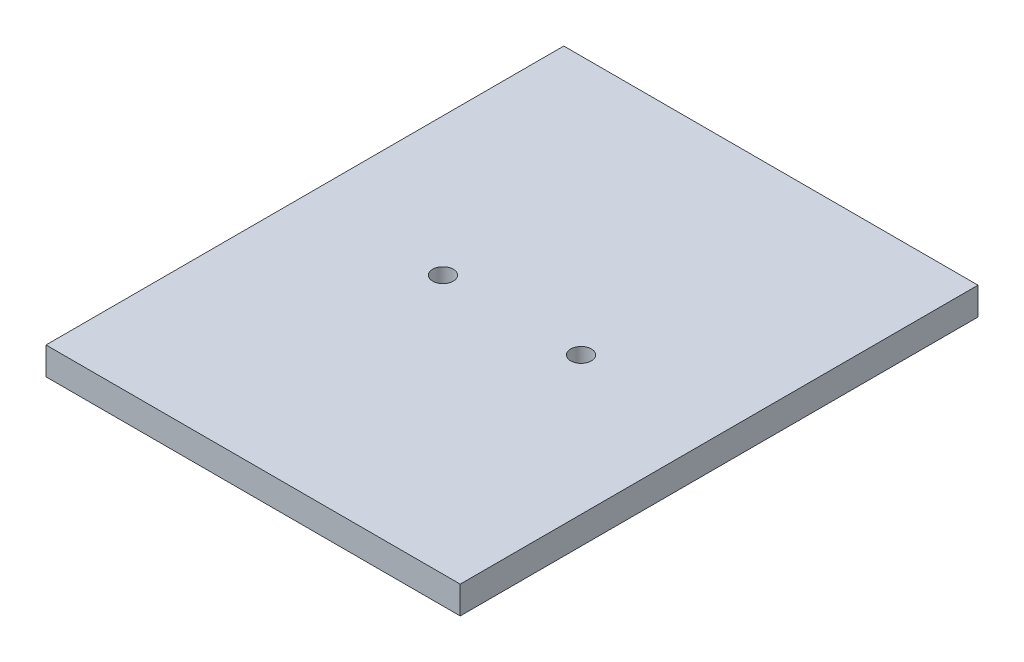
ISO-10303-21;
HEADER;
FILE_DESCRIPTION(('STEP AP214'),'2;1');
FILE_NAME('part.step','',(''),(''),'','','');
FILE_SCHEMA(('AUTOMOTIVE_DESIGN { 1 0 10303 214 1 1 1 1 }'));
ENDSEC;
DATA;
#1=APPLICATION_CONTEXT('core data for automotive mechanical design processes');
#2=APPLICATION_PROTOCOL_DEFINITION('international standard','automotive_design',2000,#1);
#3=PRODUCT_CONTEXT('',#1,'mechanical');
#4=PRODUCT('Part','Part','',(#3));
#5=PRODUCT_RELATED_PRODUCT_CATEGORY('part','',(#4));
#6=PRODUCT_DEFINITION_FORMATION('','',#4);
#7=PRODUCT_DEFINITION_CONTEXT('part definition',#1,'design');
#8=PRODUCT_DEFINITION('design','',#6,#7);
#9=PRODUCT_DEFINITION_SHAPE('','',#8);
#10=(LENGTH_UNIT() NAMED_UNIT(*) SI_UNIT(.MILLI.,.METRE.));
#11=(NAMED_UNIT(*) PLANE_ANGLE_UNIT() SI_UNIT($,.RADIAN.));
#12=(NAMED_UNIT(*) SI_UNIT($,.STERADIAN.) SOLID_ANGLE_UNIT());
#13=UNCERTAINTY_MEASURE_WITH_UNIT(LENGTH_MEASURE(1.E-05),#10,'distance_accuracy_value','');
#14=(GEOMETRIC_REPRESENTATION_CONTEXT(3) GLOBAL_UNCERTAINTY_ASSIGNED_CONTEXT((#13)) GLOBAL_UNIT_ASSIGNED_CONTEXT((#10,
#11,#12)) REPRESENTATION_CONTEXT('',''));
#15=CARTESIAN_POINT('',(0.,0.,0.));
#16=DIRECTION('',(0.,0.,1.));
#17=DIRECTION('',(1.,0.,0.));
#18=AXIS2_PLACEMENT_3D('',#15,#16,#17);
#19=CARTESIAN_POINT('',(-24.,4.,0.));
#20=DIRECTION('',(0.,1.,0.));
#21=DIRECTION('',(0.,0.,1.));
#22=AXIS2_PLACEMENT_3D('',#19,#20,#21);
#23=PLANE('',#22);
#24=DIRECTION('',(1.,0.,0.));
#25=VECTOR('',#24,1.);
#26=CARTESIAN_POINT('',(30.,4.,0.));
#27=LINE('',#26,#25);
#28=CARTESIAN_POINT('',(-30.,4.,0.));
#29=VERTEX_POINT('',#28);
#30=CARTESIAN_POINT('',(30.,4.,0.));
#31=VERTEX_POINT('',#30);
#32=EDGE_CURVE('E75',#29,#31,#27,.T.);
#33=ORIENTED_EDGE('',*,*,#32,.T.);
#34=DIRECTION('',(0.,0.,-1.));
#35=VECTOR('',#34,1.);
#36=CARTESIAN_POINT('',(30.,4.,0.));
#37=LINE('',#36,#35);
#38=CARTESIAN_POINT('',(30.,4.,-74.9999999999999));
#39=VERTEX_POINT('',#38);
#40=EDGE_CURVE('E78',#31,#39,#37,.T.);
#41=ORIENTED_EDGE('',*,*,#40,.T.);
#42=DIRECTION('',(-1.,0.,0.));
#43=VECTOR('',#42,1.);
#44=CARTESIAN_POINT('',(-30.,4.,-75.));
#45=LINE('',#44,#43);
#46=CARTESIAN_POINT('',(-30.,4.,-75.));
#47=VERTEX_POINT('',#46);
#48=EDGE_CURVE('E83',#39,#47,#45,.T.);
#49=ORIENTED_EDGE('',*,*,#48,.T.);
#50=DIRECTION('',(0.,0.,1.));
#51=VECTOR('',#50,1.);
#52=CARTESIAN_POINT('',(-30.,4.,0.));
#53=LINE('',#52,#51);
#54=EDGE_CURVE('E80',#47,#29,#53,.T.);
#55=ORIENTED_EDGE('',*,*,#54,.T.);
#56=EDGE_LOOP('',(#33,#41,#49,#55));
#57=FACE_BOUND('',#56,.T.);
#58=CARTESIAN_POINT('',(-9.99999999999999,4.,-37.5));
#59=DIRECTION('',(0.,-1.,0.));
#60=DIRECTION('',(0.,0.,-1.));
#61=AXIS2_PLACEMENT_3D('',#58,#59,#60);
#62=CIRCLE('',#61,1.5);
#63=CARTESIAN_POINT('',(-9.99999999999999,4.,-39.));
#64=VERTEX_POINT('',#63);
#65=EDGE_CURVE('E107',#64,#64,#62,.F.);
#66=ORIENTED_EDGE('',*,*,#65,.F.);
#67=EDGE_LOOP('',(#66));
#68=FACE_BOUND('',#67,.T.);
#69=CARTESIAN_POINT('',(10.,4.,-37.5));
#70=DIRECTION('',(0.,-1.,0.));
#71=DIRECTION('',(0.,0.,-1.));
#72=AXIS2_PLACEMENT_3D('',#69,#70,#71);
#73=CIRCLE('',#72,1.5);
#74=CARTESIAN_POINT('',(10.,4.,-39.));
#75=VERTEX_POINT('',#74);
#76=EDGE_CURVE('E103',#75,#75,#73,.F.);
#77=ORIENTED_EDGE('',*,*,#76,.F.);
#78=EDGE_LOOP('',(#77));
#79=FACE_BOUND('',#78,.T.);
#80=ADVANCED_FACE('F32',(#57,#68,#79),#23,.T.);
#81=CARTESIAN_POINT('',(-30.,4.,0.));
#82=DIRECTION('',(1.,0.,0.));
#83=DIRECTION('',(0.,0.,-1.));
#84=AXIS2_PLACEMENT_3D('',#81,#82,#83);
#85=PLANE('',#84);
#86=ORIENTED_EDGE('',*,*,#54,.F.);
#87=DIRECTION('',(0.,-1.,0.));
#88=VECTOR('',#87,1.);
#89=CARTESIAN_POINT('',(-30.,4.,-75.));
#90=LINE('',#89,#88);
#91=CARTESIAN_POINT('',(-30.,0.,-75.));
#92=VERTEX_POINT('',#91);
#93=EDGE_CURVE('E120',#47,#92,#90,.T.);
#94=ORIENTED_EDGE('',*,*,#93,.T.);
#95=DIRECTION('',(0.,0.,1.));
#96=VECTOR('',#95,1.);
#97=CARTESIAN_POINT('',(-30.,0.,0.));
#98=LINE('',#97,#96);
#99=CARTESIAN_POINT('',(-30.,0.,0.));
#100=VERTEX_POINT('',#99);
#101=EDGE_CURVE('E110',#92,#100,#98,.T.);
#102=ORIENTED_EDGE('',*,*,#101,.T.);
#103=DIRECTION('',(0.,-1.,0.));
#104=VECTOR('',#103,1.);
#105=CARTESIAN_POINT('',(-30.,4.,0.));
#106=LINE('',#105,#104);
#107=EDGE_CURVE('E90',#29,#100,#106,.T.);
#108=ORIENTED_EDGE('',*,*,#107,.F.);
#109=EDGE_LOOP('',(#86,#94,#102,#108));
#110=FACE_BOUND('',#109,.T.);
#111=ADVANCED_FACE('F34',(#110),#85,.F.);
#112=CARTESIAN_POINT('',(30.,4.,0.));
#113=DIRECTION('',(-1.,0.,0.));
#114=DIRECTION('',(0.,0.,1.));
#115=AXIS2_PLACEMENT_3D('',#112,#113,#114);
#116=PLANE('',#115);
#117=ORIENTED_EDGE('',*,*,#40,.F.);
#118=DIRECTION('',(0.,-1.,0.));
#119=VECTOR('',#118,1.);
#120=CARTESIAN_POINT('',(30.,4.,0.));
#121=LINE('',#120,#119);
#122=CARTESIAN_POINT('',(30.,0.,0.));
#123=VERTEX_POINT('',#122);
#124=EDGE_CURVE('E85',#31,#123,#121,.T.);
#125=ORIENTED_EDGE('',*,*,#124,.T.);
#126=DIRECTION('',(0.,0.,-1.));
#127=VECTOR('',#126,1.);
#128=CARTESIAN_POINT('',(30.,0.,0.));
#129=LINE('',#128,#127);
#130=CARTESIAN_POINT('',(30.,0.,-74.9999999999999));
#131=VERTEX_POINT('',#130);
#132=EDGE_CURVE('E123',#123,#131,#129,.T.);
#133=ORIENTED_EDGE('',*,*,#132,.T.);
#134=DIRECTION('',(0.,-1.,0.));
#135=VECTOR('',#134,1.);
#136=CARTESIAN_POINT('',(30.,4.,-74.9999999999999));
#137=LINE('',#136,#135);
#138=EDGE_CURVE('E89',#39,#131,#137,.T.);
#139=ORIENTED_EDGE('',*,*,#138,.F.);
#140=EDGE_LOOP('',(#117,#125,#133,#139));
#141=FACE_BOUND('',#140,.T.);
#142=ADVANCED_FACE('F93',(#141),#116,.F.);
#143=CARTESIAN_POINT('',(0.,0.,0.));
#144=DIRECTION('',(0.,-1.,0.));
#145=DIRECTION('',(0.,0.,-1.));
#146=AXIS2_PLACEMENT_3D('',#143,#144,#145);
#147=PLANE('',#146);
#148=CARTESIAN_POINT('',(-9.99999999999999,0.,-37.5));
#149=DIRECTION('',(0.,1.,0.));
#150=DIRECTION('',(0.,0.,1.));
#151=AXIS2_PLACEMENT_3D('',#148,#149,#150);
#152=CIRCLE('',#151,1.5);
#153=CARTESIAN_POINT('',(-9.99999999999999,0.,-39.));
#154=VERTEX_POINT('',#153);
#155=EDGE_CURVE('E41',#154,#154,#152,.T.);
#156=ORIENTED_EDGE('',*,*,#155,.T.);
#157=EDGE_LOOP('',(#156));
#158=FACE_BOUND('',#157,.T.);
#159=CARTESIAN_POINT('',(10.,0.,-37.5));
#160=DIRECTION('',(0.,1.,0.));
#161=DIRECTION('',(0.,0.,1.));
#162=AXIS2_PLACEMENT_3D('',#159,#160,#161);
#163=CIRCLE('',#162,1.5);
#164=CARTESIAN_POINT('',(10.,0.,-39.));
#165=VERTEX_POINT('',#164);
#166=EDGE_CURVE('E11',#165,#165,#163,.T.);
#167=ORIENTED_EDGE('',*,*,#166,.T.);
#168=EDGE_LOOP('',(#167));
#169=FACE_BOUND('',#168,.T.);
#170=ORIENTED_EDGE('',*,*,#101,.F.);
#171=DIRECTION('',(-1.,0.,0.));
#172=VECTOR('',#171,1.);
#173=CARTESIAN_POINT('',(-30.,0.,-75.));
#174=LINE('',#173,#172);
#175=EDGE_CURVE('E82',#131,#92,#174,.T.);
#176=ORIENTED_EDGE('',*,*,#175,.F.);
#177=ORIENTED_EDGE('',*,*,#132,.F.);
#178=DIRECTION('',(1.,0.,0.));
#179=VECTOR('',#178,1.);
#180=CARTESIAN_POINT('',(30.,0.,0.));
#181=LINE('',#180,#179);
#182=EDGE_CURVE('E49',#100,#123,#181,.T.);
#183=ORIENTED_EDGE('',*,*,#182,.F.);
#184=EDGE_LOOP('',(#170,#176,#177,#183));
#185=FACE_BOUND('',#184,.T.);
#186=ADVANCED_FACE('F129',(#158,#169,#185),#147,.T.);
#187=CARTESIAN_POINT('',(30.,4.,0.));
#188=DIRECTION('',(0.,0.,-1.));
#189=DIRECTION('',(-1.,0.,0.));
#190=AXIS2_PLACEMENT_3D('',#187,#188,#189);
#191=PLANE('',#190);
#192=ORIENTED_EDGE('',*,*,#182,.T.);
#193=ORIENTED_EDGE('',*,*,#124,.F.);
#194=ORIENTED_EDGE('',*,*,#32,.F.);
#195=ORIENTED_EDGE('',*,*,#107,.T.);
#196=EDGE_LOOP('',(#192,#193,#194,#195));
#197=FACE_BOUND('',#196,.T.);
#198=ADVANCED_FACE('F86',(#197),#191,.F.);
#199=CARTESIAN_POINT('',(-9.99999999999999,4.000012,-37.5));
#200=DIRECTION('',(0.,-1.,0.));
#201=DIRECTION('',(0.,0.,-1.));
#202=AXIS2_PLACEMENT_3D('',#199,#200,#201);
#203=CYLINDRICAL_SURFACE('',#202,1.5);
#204=CARTESIAN_POINT('',(-9.99999999999999,0.,-39.));
#205=CARTESIAN_POINT('',(-9.99999999999999,0.0416666666666666,-39.));
#206=CARTESIAN_POINT('',(-9.99999999999999,0.0833333333333331,-39.));
#207=CARTESIAN_POINT('',(-9.99999999999999,0.166666666666666,-39.));
#208=CARTESIAN_POINT('',(-9.99999999999999,0.208333333333333,-39.));
#209=CARTESIAN_POINT('',(-9.99999999999999,0.291666666666666,-39.));
#210=CARTESIAN_POINT('',(-9.99999999999999,0.333333333333333,-39.));
#211=CARTESIAN_POINT('',(-9.99999999999999,0.416666666666667,-39.));
#212=CARTESIAN_POINT('',(-9.99999999999999,0.458333333333333,-39.));
#213=CARTESIAN_POINT('',(-9.99999999999999,0.541666666666667,-39.));
#214=CARTESIAN_POINT('',(-9.99999999999999,0.583333333333333,-39.));
#215=CARTESIAN_POINT('',(-9.99999999999999,0.666666666666667,-39.));
#216=CARTESIAN_POINT('',(-9.99999999999999,0.708333333333333,-39.));
#217=CARTESIAN_POINT('',(-9.99999999999999,0.791666666666667,-39.));
#218=CARTESIAN_POINT('',(-9.99999999999999,0.833333333333333,-39.));
#219=CARTESIAN_POINT('',(-9.99999999999999,0.916666666666667,-39.));
#220=CARTESIAN_POINT('',(-9.99999999999999,0.958333333333333,-39.));
#221=CARTESIAN_POINT('',(-9.99999999999999,1.04166666666667,-39.));
#222=CARTESIAN_POINT('',(-9.99999999999999,1.08333333333333,-39.));
#223=CARTESIAN_POINT('',(-9.99999999999999,1.16666666666667,-39.));
#224=CARTESIAN_POINT('',(-9.99999999999999,1.20833333333333,-39.));
#225=CARTESIAN_POINT('',(-9.99999999999999,1.29166666666667,-39.));
#226=CARTESIAN_POINT('',(-9.99999999999999,1.33333333333333,-39.));
#227=CARTESIAN_POINT('',(-9.99999999999999,1.41666666666667,-39.));
#228=CARTESIAN_POINT('',(-9.99999999999999,1.45833333333333,-39.));
#229=CARTESIAN_POINT('',(-9.99999999999999,1.54166666666667,-39.));
#230=CARTESIAN_POINT('',(-9.99999999999999,1.58333333333333,-39.));
#231=CARTESIAN_POINT('',(-9.99999999999999,1.66666666666667,-39.));
#232=CARTESIAN_POINT('',(-9.99999999999999,1.70833333333333,-39.));
#233=CARTESIAN_POINT('',(-9.99999999999999,1.79166666666667,-39.));
#234=CARTESIAN_POINT('',(-9.99999999999999,1.83333333333333,-39.));
#235=CARTESIAN_POINT('',(-9.99999999999999,1.91666666666667,-39.));
#236=CARTESIAN_POINT('',(-9.99999999999999,1.95833333333333,-39.));
#237=CARTESIAN_POINT('',(-9.99999999999999,2.04166666666667,-39.));
#238=CARTESIAN_POINT('',(-9.99999999999999,2.08333333333333,-39.));
#239=CARTESIAN_POINT('',(-9.99999999999999,2.16666666666667,-39.));
#240=CARTESIAN_POINT('',(-9.99999999999999,2.20833333333333,-39.));
#241=CARTESIAN_POINT('',(-9.99999999999999,2.29166666666667,-39.));
#242=CARTESIAN_POINT('',(-9.99999999999999,2.33333333333333,-39.));
#243=CARTESIAN_POINT('',(-9.99999999999999,2.41666666666667,-39.));
#244=CARTESIAN_POINT('',(-9.99999999999999,2.45833333333333,-39.));
#245=CARTESIAN_POINT('',(-9.99999999999999,2.54166666666667,-39.));
#246=CARTESIAN_POINT('',(-9.99999999999999,2.58333333333333,-39.));
#247=CARTESIAN_POINT('',(-9.99999999999999,2.66666666666667,-39.));
#248=CARTESIAN_POINT('',(-9.99999999999999,2.70833333333333,-39.));
#249=CARTESIAN_POINT('',(-9.99999999999999,2.79166666666667,-39.));
#250=CARTESIAN_POINT('',(-9.99999999999999,2.83333333333333,-39.));
#251=CARTESIAN_POINT('',(-9.99999999999999,2.91666666666667,-39.));
#252=CARTESIAN_POINT('',(-9.99999999999999,2.95833333333333,-39.));
#253=CARTESIAN_POINT('',(-9.99999999999999,3.04166666666667,-39.));
#254=CARTESIAN_POINT('',(-9.99999999999999,3.08333333333333,-39.));
#255=CARTESIAN_POINT('',(-9.99999999999999,3.16666666666667,-39.));
#256=CARTESIAN_POINT('',(-9.99999999999999,3.20833333333333,-39.));
#257=CARTESIAN_POINT('',(-9.99999999999999,3.29166666666667,-39.));
#258=CARTESIAN_POINT('',(-9.99999999999999,3.33333333333333,-39.));
#259=CARTESIAN_POINT('',(-9.99999999999999,3.41666666666667,-39.));
#260=CARTESIAN_POINT('',(-9.99999999999999,3.45833333333333,-39.));
#261=CARTESIAN_POINT('',(-9.99999999999999,3.54166666666667,-39.));
#262=CARTESIAN_POINT('',(-9.99999999999999,3.58333333333333,-39.));
#263=CARTESIAN_POINT('',(-9.99999999999999,3.66666666666667,-39.));
#264=CARTESIAN_POINT('',(-9.99999999999999,3.70833333333333,-39.));
#265=CARTESIAN_POINT('',(-9.99999999999999,3.79166666666667,-39.));
#266=CARTESIAN_POINT('',(-9.99999999999999,3.83333333333333,-39.));
#267=CARTESIAN_POINT('',(-9.99999999999999,3.91666666666667,-39.));
#268=CARTESIAN_POINT('',(-9.99999999999999,3.95833333333333,-39.));
#269=CARTESIAN_POINT('',(-9.99999999999999,4.,-39.));
#270=B_SPLINE_CURVE_WITH_KNOTS('',3,(#204,#205,#206,#207,#208,#209,#210,#211,#212,#213,#214,
#215,#216,#217,#218,#219,#220,#221,#222,#223,#224,#225,#226,#227,#228,#229,#230,#231,#232,#233,
#234,#235,#236,#237,#238,#239,#240,#241,#242,#243,#244,#245,#246,#247,#248,#249,#250,#251,#252,
#253,#254,#255,#256,#257,#258,#259,#260,#261,#262,#263,#264,#265,#266,#267,#268,#269),
.UNSPECIFIED.,.F.,.F.,(4,2,2,2,2,2,2,2,2,2,2,2,2,2,2,2,2,2,2,2,2,2,2,2,2,2,2,2,2,2,2,2,4),(0.,
0.125,0.25,0.375,0.5,0.625,0.75,0.875,1.,1.125,1.25,1.375,1.5,1.625,1.75,1.875,2.,2.125,2.25,
2.375,2.5,2.625,2.75,2.875,3.,3.125,3.25,3.375,3.5,3.625,3.75,3.875,4.),.UNSPECIFIED.);
#271=EDGE_CURVE('BSEAM137',#154,#64,#270,.T.);
#272=ORIENTED_EDGE('',*,*,#155,.F.);
#273=ORIENTED_EDGE('',*,*,#65,.T.);
#274=ORIENTED_EDGE('',*,*,#271,.T.);
#275=ORIENTED_EDGE('',*,*,#271,.F.);
#276=EDGE_LOOP('',(#272,#274,#273,#275));
#277=FACE_BOUND('',#276,.T.);
#278=ADVANCED_FACE('F137',(#277),#203,.F.);
#279=CARTESIAN_POINT('',(10.,4.000012,-37.5));
#280=DIRECTION('',(0.,-1.,0.));
#281=DIRECTION('',(0.,0.,-1.));
#282=AXIS2_PLACEMENT_3D('',#279,#280,#281);
#283=CYLINDRICAL_SURFACE('',#282,1.5);
#284=CARTESIAN_POINT('',(10.,0.,-39.));
#285=CARTESIAN_POINT('',(10.,0.0416666666666666,-39.));
#286=CARTESIAN_POINT('',(10.,0.0833333333333331,-39.));
#287=CARTESIAN_POINT('',(10.,0.166666666666666,-39.));
#288=CARTESIAN_POINT('',(10.,0.208333333333333,-39.));
#289=CARTESIAN_POINT('',(10.,0.291666666666666,-39.));
#290=CARTESIAN_POINT('',(10.,0.333333333333333,-39.));
#291=CARTESIAN_POINT('',(10.,0.416666666666667,-39.));
#292=CARTESIAN_POINT('',(10.,0.458333333333333,-39.));
#293=CARTESIAN_POINT('',(10.,0.541666666666667,-39.));
#294=CARTESIAN_POINT('',(10.,0.583333333333333,-39.));
#295=CARTESIAN_POINT('',(10.,0.666666666666667,-39.));
#296=CARTESIAN_POINT('',(10.,0.708333333333333,-39.));
#297=CARTESIAN_POINT('',(10.,0.791666666666667,-39.));
#298=CARTESIAN_POINT('',(10.,0.833333333333333,-39.));
#299=CARTESIAN_POINT('',(10.,0.916666666666667,-39.));
#300=CARTESIAN_POINT('',(10.,0.958333333333333,-39.));
#301=CARTESIAN_POINT('',(10.,1.04166666666667,-39.));
#302=CARTESIAN_POINT('',(10.,1.08333333333333,-39.));
#303=CARTESIAN_POINT('',(10.,1.16666666666667,-39.));
#304=CARTESIAN_POINT('',(10.,1.20833333333333,-39.));
#305=CARTESIAN_POINT('',(10.,1.29166666666667,-39.));
#306=CARTESIAN_POINT('',(10.,1.33333333333333,-39.));
#307=CARTESIAN_POINT('',(10.,1.41666666666667,-39.));
#308=CARTESIAN_POINT('',(10.,1.45833333333333,-39.));
#309=CARTESIAN_POINT('',(10.,1.54166666666667,-39.));
#310=CARTESIAN_POINT('',(10.,1.58333333333333,-39.));
#311=CARTESIAN_POINT('',(10.,1.66666666666667,-39.));
#312=CARTESIAN_POINT('',(10.,1.70833333333333,-39.));
#313=CARTESIAN_POINT('',(10.,1.79166666666667,-39.));
#314=CARTESIAN_POINT('',(10.,1.83333333333333,-39.));
#315=CARTESIAN_POINT('',(10.,1.91666666666667,-39.));
#316=CARTESIAN_POINT('',(10.,1.95833333333333,-39.));
#317=CARTESIAN_POINT('',(10.,2.04166666666667,-39.));
#318=CARTESIAN_POINT('',(10.,2.08333333333333,-39.));
#319=CARTESIAN_POINT('',(10.,2.16666666666667,-39.));
#320=CARTESIAN_POINT('',(10.,2.20833333333333,-39.));
#321=CARTESIAN_POINT('',(10.,2.29166666666667,-39.));
#322=CARTESIAN_POINT('',(10.,2.33333333333333,-39.));
#323=CARTESIAN_POINT('',(10.,2.41666666666667,-39.));
#324=CARTESIAN_POINT('',(10.,2.45833333333333,-39.));
#325=CARTESIAN_POINT('',(10.,2.54166666666667,-39.));
#326=CARTESIAN_POINT('',(10.,2.58333333333333,-39.));
#327=CARTESIAN_POINT('',(10.,2.66666666666667,-39.));
#328=CARTESIAN_POINT('',(10.,2.70833333333333,-39.));
#329=CARTESIAN_POINT('',(10.,2.79166666666667,-39.));
#330=CARTESIAN_POINT('',(10.,2.83333333333333,-39.));
#331=CARTESIAN_POINT('',(10.,2.91666666666667,-39.));
#332=CARTESIAN_POINT('',(10.,2.95833333333333,-39.));
#333=CARTESIAN_POINT('',(10.,3.04166666666667,-39.));
#334=CARTESIAN_POINT('',(10.,3.08333333333333,-39.));
#335=CARTESIAN_POINT('',(10.,3.16666666666667,-39.));
#336=CARTESIAN_POINT('',(10.,3.20833333333333,-39.));
#337=CARTESIAN_POINT('',(10.,3.29166666666667,-39.));
#338=CARTESIAN_POINT('',(10.,3.33333333333333,-39.));
#339=CARTESIAN_POINT('',(10.,3.41666666666667,-39.));
#340=CARTESIAN_POINT('',(10.,3.45833333333333,-39.));
#341=CARTESIAN_POINT('',(10.,3.54166666666667,-39.));
#342=CARTESIAN_POINT('',(10.,3.58333333333333,-39.));
#343=CARTESIAN_POINT('',(10.,3.66666666666667,-39.));
#344=CARTESIAN_POINT('',(10.,3.70833333333333,-39.));
#345=CARTESIAN_POINT('',(10.,3.79166666666667,-39.));
#346=CARTESIAN_POINT('',(10.,3.83333333333333,-39.));
#347=CARTESIAN_POINT('',(10.,3.91666666666667,-39.));
#348=CARTESIAN_POINT('',(10.,3.95833333333333,-39.));
#349=CARTESIAN_POINT('',(10.,4.,-39.));
#350=B_SPLINE_CURVE_WITH_KNOTS('',3,(#284,#285,#286,#287,#288,#289,#290,#291,#292,#293,#294,
#295,#296,#297,#298,#299,#300,#301,#302,#303,#304,#305,#306,#307,#308,#309,#310,#311,#312,#313,
#314,#315,#316,#317,#318,#319,#320,#321,#322,#323,#324,#325,#326,#327,#328,#329,#330,#331,#332,
#333,#334,#335,#336,#337,#338,#339,#340,#341,#342,#343,#344,#345,#346,#347,#348,#349),
.UNSPECIFIED.,.F.,.F.,(4,2,2,2,2,2,2,2,2,2,2,2,2,2,2,2,2,2,2,2,2,2,2,2,2,2,2,2,2,2,2,2,4),(0.,
0.125,0.25,0.375,0.5,0.625,0.75,0.875,1.,1.125,1.25,1.375,1.5,1.625,1.75,1.875,2.,2.125,2.25,
2.375,2.5,2.625,2.75,2.875,3.,3.125,3.25,3.375,3.5,3.625,3.75,3.875,4.),.UNSPECIFIED.);
#351=EDGE_CURVE('BSEAM133',#165,#75,#350,.T.);
#352=ORIENTED_EDGE('',*,*,#166,.F.);
#353=ORIENTED_EDGE('',*,*,#76,.T.);
#354=ORIENTED_EDGE('',*,*,#351,.T.);
#355=ORIENTED_EDGE('',*,*,#351,.F.);
#356=EDGE_LOOP('',(#352,#354,#353,#355));
#357=FACE_BOUND('',#356,.T.);
#358=ADVANCED_FACE('F133',(#357),#283,.F.);
#359=CARTESIAN_POINT('',(-30.,4.,-75.));
#360=DIRECTION('',(0.,0.,1.));
#361=DIRECTION('',(1.,0.,0.));
#362=AXIS2_PLACEMENT_3D('',#359,#360,#361);
#363=PLANE('',#362);
#364=ORIENTED_EDGE('',*,*,#48,.F.);
#365=ORIENTED_EDGE('',*,*,#138,.T.);
#366=ORIENTED_EDGE('',*,*,#175,.T.);
#367=ORIENTED_EDGE('',*,*,#93,.F.);
#368=EDGE_LOOP('',(#364,#365,#366,#367));
#369=FACE_BOUND('',#368,.T.);
#370=ADVANCED_FACE('F131',(#369),#363,.F.);
#371=CLOSED_SHELL('',(#80,#111,#142,#186,#198,#278,#358,#370));
#372=MANIFOLD_SOLID_BREP('B2',#371);
#373=ADVANCED_BREP_SHAPE_REPRESENTATION('',(#18,#372),#14);
#374=SHAPE_DEFINITION_REPRESENTATION(#9,#373);
ENDSEC;
END-ISO-10303-21;
